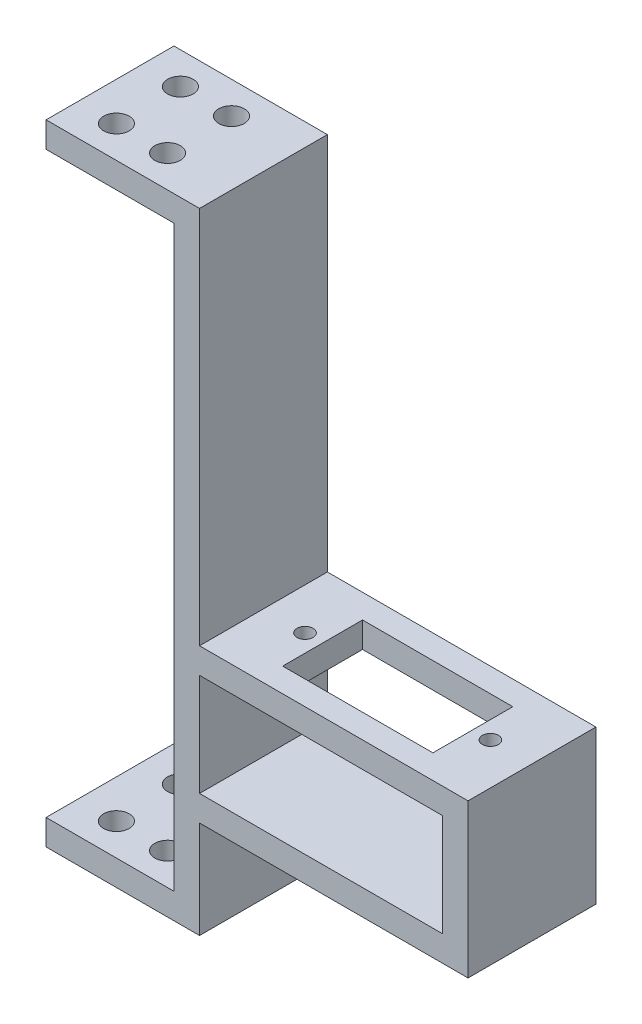
ISO-10303-21;
HEADER;
FILE_DESCRIPTION(('STEP AP214'),'2;1');
FILE_NAME('part.step','',(''),(''),'','','');
FILE_SCHEMA(('AUTOMOTIVE_DESIGN { 1 0 10303 214 1 1 1 1 }'));
ENDSEC;
DATA;
#1=APPLICATION_CONTEXT('core data for automotive mechanical design processes');
#2=APPLICATION_PROTOCOL_DEFINITION('international standard','automotive_design',2000,#1);
#3=PRODUCT_CONTEXT('',#1,'mechanical');
#4=PRODUCT('Part','Part','',(#3));
#5=PRODUCT_RELATED_PRODUCT_CATEGORY('part','',(#4));
#6=PRODUCT_DEFINITION_FORMATION('','',#4);
#7=PRODUCT_DEFINITION_CONTEXT('part definition',#1,'design');
#8=PRODUCT_DEFINITION('design','',#6,#7);
#9=PRODUCT_DEFINITION_SHAPE('','',#8);
#10=(LENGTH_UNIT() NAMED_UNIT(*) SI_UNIT(.MILLI.,.METRE.));
#11=(NAMED_UNIT(*) PLANE_ANGLE_UNIT() SI_UNIT($,.RADIAN.));
#12=(NAMED_UNIT(*) SI_UNIT($,.STERADIAN.) SOLID_ANGLE_UNIT());
#13=UNCERTAINTY_MEASURE_WITH_UNIT(LENGTH_MEASURE(1.E-05),#10,'distance_accuracy_value','');
#14=(GEOMETRIC_REPRESENTATION_CONTEXT(3) GLOBAL_UNCERTAINTY_ASSIGNED_CONTEXT((#13)) GLOBAL_UNIT_ASSIGNED_CONTEXT((#10,
#11,#12)) REPRESENTATION_CONTEXT('',''));
#15=CARTESIAN_POINT('',(0.,0.,0.));
#16=DIRECTION('',(0.,0.,1.));
#17=DIRECTION('',(1.,0.,0.));
#18=AXIS2_PLACEMENT_3D('',#15,#16,#17);
#19=CARTESIAN_POINT('',(0.,49.25,10.));
#20=DIRECTION('',(-1.,0.,0.));
#21=DIRECTION('',(0.,0.,1.));
#22=AXIS2_PLACEMENT_3D('',#19,#20,#21);
#23=PLANE('',#22);
#24=DIRECTION('',(0.,1.,0.));
#25=VECTOR('',#24,1.);
#26=CARTESIAN_POINT('',(0.,49.25,-10.));
#27=LINE('',#26,#25);
#28=CARTESIAN_POINT('',(0.,-49.25,-10.));
#29=VERTEX_POINT('',#28);
#30=CARTESIAN_POINT('',(0.,-34.,-10.));
#31=VERTEX_POINT('',#30);
#32=EDGE_CURVE('E289',#29,#31,#27,.T.);
#33=ORIENTED_EDGE('',*,*,#32,.T.);
#34=DIRECTION('',(0.,0.,1.));
#35=VECTOR('',#34,1.);
#36=CARTESIAN_POINT('',(0.,-34.,-10.));
#37=LINE('',#36,#35);
#38=CARTESIAN_POINT('',(0.,-34.,10.));
#39=VERTEX_POINT('',#38);
#40=EDGE_CURVE('E244',#31,#39,#37,.T.);
#41=ORIENTED_EDGE('',*,*,#40,.T.);
#42=DIRECTION('',(0.,1.,0.));
#43=VECTOR('',#42,1.);
#44=CARTESIAN_POINT('',(0.,49.25,10.));
#45=LINE('',#44,#43);
#46=CARTESIAN_POINT('',(0.,-49.25,10.));
#47=VERTEX_POINT('',#46);
#48=EDGE_CURVE('E269',#47,#39,#45,.T.);
#49=ORIENTED_EDGE('',*,*,#48,.F.);
#50=DIRECTION('',(0.,0.,-1.));
#51=VECTOR('',#50,1.);
#52=CARTESIAN_POINT('',(0.,-49.25,10.));
#53=LINE('',#52,#51);
#54=EDGE_CURVE('E298',#47,#29,#53,.T.);
#55=ORIENTED_EDGE('',*,*,#54,.T.);
#56=EDGE_LOOP('',(#33,#41,#49,#55));
#57=FACE_BOUND('',#56,.T.);
#58=ADVANCED_FACE('F33',(#57),#23,.F.);
#59=CARTESIAN_POINT('',(0.,-9.99999999999999,10.));
#60=VERTEX_POINT('',#59);
#61=CARTESIAN_POINT('',(0.,49.25,10.));
#62=VERTEX_POINT('',#61);
#63=EDGE_CURVE('E268',#60,#62,#45,.T.);
#64=ORIENTED_EDGE('',*,*,#63,.F.);
#65=DIRECTION('',(0.,0.,1.));
#66=VECTOR('',#65,1.);
#67=CARTESIAN_POINT('',(0.,-10.,-10.));
#68=LINE('',#67,#66);
#69=CARTESIAN_POINT('',(0.,-10.,-10.));
#70=VERTEX_POINT('',#69);
#71=EDGE_CURVE('E236',#70,#60,#68,.T.);
#72=ORIENTED_EDGE('',*,*,#71,.F.);
#73=CARTESIAN_POINT('',(0.,49.25,-10.));
#74=VERTEX_POINT('',#73);
#75=EDGE_CURVE('E288',#70,#74,#27,.T.);
#76=ORIENTED_EDGE('',*,*,#75,.T.);
#77=DIRECTION('',(0.,0.,-1.));
#78=VECTOR('',#77,1.);
#79=CARTESIAN_POINT('',(0.,49.25,10.));
#80=LINE('',#79,#78);
#81=EDGE_CURVE('E295',#62,#74,#80,.T.);
#82=ORIENTED_EDGE('',*,*,#81,.F.);
#83=EDGE_LOOP('',(#64,#72,#76,#82));
#84=FACE_BOUND('',#83,.T.);
#85=ADVANCED_FACE('F414',(#84),#23,.F.);
#86=CARTESIAN_POINT('',(-24.,49.25,10.));
#87=DIRECTION('',(1.,0.,0.));
#88=DIRECTION('',(0.,0.,-1.));
#89=AXIS2_PLACEMENT_3D('',#86,#87,#88);
#90=PLANE('',#89);
#91=DIRECTION('',(0.,-1.,0.));
#92=VECTOR('',#91,1.);
#93=CARTESIAN_POINT('',(-24.,49.25,-10.));
#94=LINE('',#93,#92);
#95=CARTESIAN_POINT('',(-24.,49.25,-10.));
#96=VERTEX_POINT('',#95);
#97=CARTESIAN_POINT('',(-24.,45.25,-10.));
#98=VERTEX_POINT('',#97);
#99=EDGE_CURVE('E239',#96,#98,#94,.T.);
#100=ORIENTED_EDGE('',*,*,#99,.T.);
#101=DIRECTION('',(0.,0.,-1.));
#102=VECTOR('',#101,1.);
#103=CARTESIAN_POINT('',(-24.,45.25,10.));
#104=LINE('',#103,#102);
#105=CARTESIAN_POINT('',(-24.,45.25,10.));
#106=VERTEX_POINT('',#105);
#107=EDGE_CURVE('E313',#106,#98,#104,.T.);
#108=ORIENTED_EDGE('',*,*,#107,.F.);
#109=DIRECTION('',(0.,-1.,0.));
#110=VECTOR('',#109,1.);
#111=CARTESIAN_POINT('',(-24.,49.25,10.));
#112=LINE('',#111,#110);
#113=CARTESIAN_POINT('',(-24.,49.25,10.));
#114=VERTEX_POINT('',#113);
#115=EDGE_CURVE('E254',#114,#106,#112,.T.);
#116=ORIENTED_EDGE('',*,*,#115,.F.);
#117=DIRECTION('',(0.,0.,-1.));
#118=VECTOR('',#117,1.);
#119=CARTESIAN_POINT('',(-24.,49.25,10.));
#120=LINE('',#119,#118);
#121=EDGE_CURVE('E275',#114,#96,#120,.T.);
#122=ORIENTED_EDGE('',*,*,#121,.T.);
#123=EDGE_LOOP('',(#100,#108,#116,#122));
#124=FACE_BOUND('',#123,.T.);
#125=ADVANCED_FACE('F35',(#124),#90,.F.);
#126=CARTESIAN_POINT('',(-24.,45.25,10.));
#127=DIRECTION('',(0.,1.,0.));
#128=DIRECTION('',(0.,0.,1.));
#129=AXIS2_PLACEMENT_3D('',#126,#127,#128);
#130=PLANE('',#129);
#131=CARTESIAN_POINT('',(-18.,45.25,-5.));
#132=DIRECTION('',(0.,1.,0.));
#133=DIRECTION('',(0.,0.,1.));
#134=AXIS2_PLACEMENT_3D('',#131,#132,#133);
#135=CIRCLE('',#134,2.);
#136=CARTESIAN_POINT('',(-18.,45.25,-3.));
#137=VERTEX_POINT('',#136);
#138=EDGE_CURVE('E331',#137,#137,#135,.T.);
#139=ORIENTED_EDGE('',*,*,#138,.T.);
#140=EDGE_LOOP('',(#139));
#141=FACE_BOUND('',#140,.T.);
#142=CARTESIAN_POINT('',(-9.99999999999996,45.25,-5.));
#143=DIRECTION('',(0.,1.,0.));
#144=DIRECTION('',(0.,0.,1.));
#145=AXIS2_PLACEMENT_3D('',#142,#143,#144);
#146=CIRCLE('',#145,2.);
#147=CARTESIAN_POINT('',(-9.99999999999996,45.25,-3.));
#148=VERTEX_POINT('',#147);
#149=EDGE_CURVE('E339',#148,#148,#146,.T.);
#150=ORIENTED_EDGE('',*,*,#149,.T.);
#151=EDGE_LOOP('',(#150));
#152=FACE_BOUND('',#151,.T.);
#153=CARTESIAN_POINT('',(-9.99999999999997,45.25,5.));
#154=DIRECTION('',(0.,1.,0.));
#155=DIRECTION('',(0.,0.,1.));
#156=AXIS2_PLACEMENT_3D('',#153,#154,#155);
#157=CIRCLE('',#156,2.);
#158=CARTESIAN_POINT('',(-9.99999999999997,45.25,7.));
#159=VERTEX_POINT('',#158);
#160=EDGE_CURVE('E345',#159,#159,#157,.T.);
#161=ORIENTED_EDGE('',*,*,#160,.T.);
#162=EDGE_LOOP('',(#161));
#163=FACE_BOUND('',#162,.T.);
#164=CARTESIAN_POINT('',(-18.,45.25,5.));
#165=DIRECTION('',(0.,1.,0.));
#166=DIRECTION('',(0.,0.,1.));
#167=AXIS2_PLACEMENT_3D('',#164,#165,#166);
#168=CIRCLE('',#167,2.);
#169=CARTESIAN_POINT('',(-18.,45.25,7.));
#170=VERTEX_POINT('',#169);
#171=EDGE_CURVE('E351',#170,#170,#168,.T.);
#172=ORIENTED_EDGE('',*,*,#171,.T.);
#173=EDGE_LOOP('',(#172));
#174=FACE_BOUND('',#173,.T.);
#175=DIRECTION('',(1.,0.,0.));
#176=VECTOR('',#175,1.);
#177=CARTESIAN_POINT('',(-24.,45.25,-10.));
#178=LINE('',#177,#176);
#179=CARTESIAN_POINT('',(-4.,45.25,-10.));
#180=VERTEX_POINT('',#179);
#181=EDGE_CURVE('E278',#98,#180,#178,.T.);
#182=ORIENTED_EDGE('',*,*,#181,.T.);
#183=DIRECTION('',(0.,0.,-1.));
#184=VECTOR('',#183,1.);
#185=CARTESIAN_POINT('',(-4.,45.25,10.));
#186=LINE('',#185,#184);
#187=CARTESIAN_POINT('',(-4.,45.25,10.));
#188=VERTEX_POINT('',#187);
#189=EDGE_CURVE('E310',#188,#180,#186,.T.);
#190=ORIENTED_EDGE('',*,*,#189,.F.);
#191=DIRECTION('',(1.,0.,0.));
#192=VECTOR('',#191,1.);
#193=CARTESIAN_POINT('',(-24.,45.25,10.));
#194=LINE('',#193,#192);
#195=EDGE_CURVE('E257',#106,#188,#194,.T.);
#196=ORIENTED_EDGE('',*,*,#195,.F.);
#197=ORIENTED_EDGE('',*,*,#107,.T.);
#198=EDGE_LOOP('',(#182,#190,#196,#197));
#199=FACE_BOUND('',#198,.T.);
#200=ADVANCED_FACE('F408',(#141,#152,#163,#174,#199),#130,.F.);
#201=CARTESIAN_POINT('',(-4.,45.25,10.));
#202=DIRECTION('',(1.,0.,0.));
#203=DIRECTION('',(0.,1.,0.));
#204=AXIS2_PLACEMENT_3D('',#201,#202,#203);
#205=PLANE('',#204);
#206=DIRECTION('',(0.,-1.,0.));
#207=VECTOR('',#206,1.);
#208=CARTESIAN_POINT('',(-4.,45.25,-10.));
#209=LINE('',#208,#207);
#210=CARTESIAN_POINT('',(-3.99999999999999,-45.25,-10.));
#211=VERTEX_POINT('',#210);
#212=EDGE_CURVE('E280',#180,#211,#209,.T.);
#213=ORIENTED_EDGE('',*,*,#212,.T.);
#214=DIRECTION('',(0.,0.,-1.));
#215=VECTOR('',#214,1.);
#216=CARTESIAN_POINT('',(-3.99999999999999,-45.25,10.));
#217=LINE('',#216,#215);
#218=CARTESIAN_POINT('',(-3.99999999999999,-45.25,10.));
#219=VERTEX_POINT('',#218);
#220=EDGE_CURVE('E307',#219,#211,#217,.T.);
#221=ORIENTED_EDGE('',*,*,#220,.F.);
#222=DIRECTION('',(0.,-1.,0.));
#223=VECTOR('',#222,1.);
#224=CARTESIAN_POINT('',(-4.,45.25,10.));
#225=LINE('',#224,#223);
#226=EDGE_CURVE('E260',#188,#219,#225,.T.);
#227=ORIENTED_EDGE('',*,*,#226,.F.);
#228=ORIENTED_EDGE('',*,*,#189,.T.);
#229=EDGE_LOOP('',(#213,#221,#227,#228));
#230=FACE_BOUND('',#229,.T.);
#231=ADVANCED_FACE('F469',(#230),#205,.F.);
#232=CARTESIAN_POINT('',(-3.99999999999999,-45.25,10.));
#233=DIRECTION('',(0.,-1.,0.));
#234=DIRECTION('',(0.,0.,-1.));
#235=AXIS2_PLACEMENT_3D('',#232,#233,#234);
#236=PLANE('',#235);
#237=CARTESIAN_POINT('',(-17.9999999999999,-45.25,-5.));
#238=DIRECTION('',(0.,-1.,0.));
#239=DIRECTION('',(0.,0.,-1.));
#240=AXIS2_PLACEMENT_3D('',#237,#238,#239);
#241=CIRCLE('',#240,2.);
#242=CARTESIAN_POINT('',(-17.9999999999999,-45.25,-7.));
#243=VERTEX_POINT('',#242);
#244=EDGE_CURVE('E336',#243,#243,#241,.T.);
#245=ORIENTED_EDGE('',*,*,#244,.T.);
#246=EDGE_LOOP('',(#245));
#247=FACE_BOUND('',#246,.T.);
#248=CARTESIAN_POINT('',(-9.99999999999993,-45.25,-5.));
#249=DIRECTION('',(0.,-1.,0.));
#250=DIRECTION('',(0.,0.,-1.));
#251=AXIS2_PLACEMENT_3D('',#248,#249,#250);
#252=CIRCLE('',#251,2.);
#253=CARTESIAN_POINT('',(-9.99999999999993,-45.25,-7.));
#254=VERTEX_POINT('',#253);
#255=EDGE_CURVE('E342',#254,#254,#252,.T.);
#256=ORIENTED_EDGE('',*,*,#255,.T.);
#257=EDGE_LOOP('',(#256));
#258=FACE_BOUND('',#257,.T.);
#259=CARTESIAN_POINT('',(-9.99999999999993,-45.25,5.));
#260=DIRECTION('',(0.,-1.,0.));
#261=DIRECTION('',(0.,0.,-1.));
#262=AXIS2_PLACEMENT_3D('',#259,#260,#261);
#263=CIRCLE('',#262,2.);
#264=CARTESIAN_POINT('',(-9.99999999999993,-45.25,3.));
#265=VERTEX_POINT('',#264);
#266=EDGE_CURVE('E348',#265,#265,#263,.T.);
#267=ORIENTED_EDGE('',*,*,#266,.T.);
#268=EDGE_LOOP('',(#267));
#269=FACE_BOUND('',#268,.T.);
#270=CARTESIAN_POINT('',(-17.9999999999999,-45.25,5.));
#271=DIRECTION('',(0.,-1.,0.));
#272=DIRECTION('',(0.,0.,-1.));
#273=AXIS2_PLACEMENT_3D('',#270,#271,#272);
#274=CIRCLE('',#273,2.);
#275=CARTESIAN_POINT('',(-17.9999999999999,-45.25,3.));
#276=VERTEX_POINT('',#275);
#277=EDGE_CURVE('E354',#276,#276,#274,.T.);
#278=ORIENTED_EDGE('',*,*,#277,.T.);
#279=EDGE_LOOP('',(#278));
#280=FACE_BOUND('',#279,.T.);
#281=DIRECTION('',(-1.,0.,0.));
#282=VECTOR('',#281,1.);
#283=CARTESIAN_POINT('',(-3.99999999999999,-45.25,-10.));
#284=LINE('',#283,#282);
#285=CARTESIAN_POINT('',(-24.,-45.25,-10.));
#286=VERTEX_POINT('',#285);
#287=EDGE_CURVE('E282',#211,#286,#284,.T.);
#288=ORIENTED_EDGE('',*,*,#287,.T.);
#289=DIRECTION('',(0.,0.,-1.));
#290=VECTOR('',#289,1.);
#291=CARTESIAN_POINT('',(-24.,-45.25,10.));
#292=LINE('',#291,#290);
#293=CARTESIAN_POINT('',(-24.,-45.25,10.));
#294=VERTEX_POINT('',#293);
#295=EDGE_CURVE('E304',#294,#286,#292,.T.);
#296=ORIENTED_EDGE('',*,*,#295,.F.);
#297=DIRECTION('',(-1.,0.,0.));
#298=VECTOR('',#297,1.);
#299=CARTESIAN_POINT('',(-3.99999999999999,-45.25,10.));
#300=LINE('',#299,#298);
#301=EDGE_CURVE('E262',#219,#294,#300,.T.);
#302=ORIENTED_EDGE('',*,*,#301,.F.);
#303=ORIENTED_EDGE('',*,*,#220,.T.);
#304=EDGE_LOOP('',(#288,#296,#302,#303));
#305=FACE_BOUND('',#304,.T.);
#306=ADVANCED_FACE('F462',(#247,#258,#269,#280,#305),#236,.F.);
#307=CARTESIAN_POINT('',(-24.,-49.25,10.));
#308=DIRECTION('',(1.,0.,0.));
#309=DIRECTION('',(0.,0.,-1.));
#310=AXIS2_PLACEMENT_3D('',#307,#308,#309);
#311=PLANE('',#310);
#312=DIRECTION('',(0.,-1.,0.));
#313=VECTOR('',#312,1.);
#314=CARTESIAN_POINT('',(-24.,-49.25,-10.));
#315=LINE('',#314,#313);
#316=CARTESIAN_POINT('',(-24.,-49.25,-10.));
#317=VERTEX_POINT('',#316);
#318=EDGE_CURVE('E284',#286,#317,#315,.T.);
#319=ORIENTED_EDGE('',*,*,#318,.T.);
#320=DIRECTION('',(0.,0.,-1.));
#321=VECTOR('',#320,1.);
#322=CARTESIAN_POINT('',(-24.,-49.25,10.));
#323=LINE('',#322,#321);
#324=CARTESIAN_POINT('',(-24.,-49.25,10.));
#325=VERTEX_POINT('',#324);
#326=EDGE_CURVE('E301',#325,#317,#323,.T.);
#327=ORIENTED_EDGE('',*,*,#326,.F.);
#328=DIRECTION('',(0.,-1.,0.));
#329=VECTOR('',#328,1.);
#330=CARTESIAN_POINT('',(-24.,-49.25,10.));
#331=LINE('',#330,#329);
#332=EDGE_CURVE('E264',#294,#325,#331,.T.);
#333=ORIENTED_EDGE('',*,*,#332,.F.);
#334=ORIENTED_EDGE('',*,*,#295,.T.);
#335=EDGE_LOOP('',(#319,#327,#333,#334));
#336=FACE_BOUND('',#335,.T.);
#337=ADVANCED_FACE('F457',(#336),#311,.F.);
#338=CARTESIAN_POINT('',(0.,-49.25,10.));
#339=DIRECTION('',(0.,1.,0.));
#340=DIRECTION('',(-1.,0.,0.));
#341=AXIS2_PLACEMENT_3D('',#338,#339,#340);
#342=PLANE('',#341);
#343=CARTESIAN_POINT('',(-17.9999999999999,-49.25,-5.));
#344=DIRECTION('',(0.,1.,0.));
#345=DIRECTION('',(-1.,0.,0.));
#346=AXIS2_PLACEMENT_3D('',#343,#344,#345);
#347=CIRCLE('',#346,2.);
#348=CARTESIAN_POINT('',(-19.9999999999999,-49.25,-5.));
#349=VERTEX_POINT('',#348);
#350=EDGE_CURVE('E364',#349,#349,#347,.T.);
#351=ORIENTED_EDGE('',*,*,#350,.T.);
#352=EDGE_LOOP('',(#351));
#353=FACE_BOUND('',#352,.T.);
#354=CARTESIAN_POINT('',(-9.99999999999993,-49.25,-5.));
#355=DIRECTION('',(0.,1.,0.));
#356=DIRECTION('',(-1.,0.,0.));
#357=AXIS2_PLACEMENT_3D('',#354,#355,#356);
#358=CIRCLE('',#357,2.);
#359=CARTESIAN_POINT('',(-11.9999999999999,-49.25,-5.));
#360=VERTEX_POINT('',#359);
#361=EDGE_CURVE('E370',#360,#360,#358,.T.);
#362=ORIENTED_EDGE('',*,*,#361,.T.);
#363=EDGE_LOOP('',(#362));
#364=FACE_BOUND('',#363,.T.);
#365=CARTESIAN_POINT('',(-9.99999999999993,-49.25,5.));
#366=DIRECTION('',(0.,1.,0.));
#367=DIRECTION('',(-1.,0.,0.));
#368=AXIS2_PLACEMENT_3D('',#365,#366,#367);
#369=CIRCLE('',#368,2.);
#370=CARTESIAN_POINT('',(-11.9999999999999,-49.25,5.));
#371=VERTEX_POINT('',#370);
#372=EDGE_CURVE('E376',#371,#371,#369,.T.);
#373=ORIENTED_EDGE('',*,*,#372,.T.);
#374=EDGE_LOOP('',(#373));
#375=FACE_BOUND('',#374,.T.);
#376=CARTESIAN_POINT('',(-17.9999999999999,-49.25,5.));
#377=DIRECTION('',(0.,1.,0.));
#378=DIRECTION('',(-1.,0.,0.));
#379=AXIS2_PLACEMENT_3D('',#376,#377,#378);
#380=CIRCLE('',#379,2.);
#381=CARTESIAN_POINT('',(-19.9999999999999,-49.25,5.));
#382=VERTEX_POINT('',#381);
#383=EDGE_CURVE('E357',#382,#382,#380,.T.);
#384=ORIENTED_EDGE('',*,*,#383,.T.);
#385=EDGE_LOOP('',(#384));
#386=FACE_BOUND('',#385,.T.);
#387=DIRECTION('',(1.,0.,0.));
#388=VECTOR('',#387,1.);
#389=CARTESIAN_POINT('',(0.,-49.25,-10.));
#390=LINE('',#389,#388);
#391=EDGE_CURVE('E286',#317,#29,#390,.T.);
#392=ORIENTED_EDGE('',*,*,#391,.T.);
#393=ORIENTED_EDGE('',*,*,#54,.F.);
#394=DIRECTION('',(1.,0.,0.));
#395=VECTOR('',#394,1.);
#396=CARTESIAN_POINT('',(0.,-49.25,10.));
#397=LINE('',#396,#395);
#398=EDGE_CURVE('E266',#325,#47,#397,.T.);
#399=ORIENTED_EDGE('',*,*,#398,.F.);
#400=ORIENTED_EDGE('',*,*,#326,.T.);
#401=EDGE_LOOP('',(#392,#393,#399,#400));
#402=FACE_BOUND('',#401,.T.);
#403=ADVANCED_FACE('F453',(#353,#364,#375,#386,#402),#342,.F.);
#404=CARTESIAN_POINT('',(0.,-30.,10.));
#405=VERTEX_POINT('',#404);
#406=CARTESIAN_POINT('',(0.,-14.,10.));
#407=VERTEX_POINT('',#406);
#408=EDGE_CURVE('E273',#405,#407,#45,.T.);
#409=ORIENTED_EDGE('',*,*,#408,.F.);
#410=DIRECTION('',(0.,0.,1.));
#411=VECTOR('',#410,1.);
#412=CARTESIAN_POINT('',(0.,-30.,-10.));
#413=LINE('',#412,#411);
#414=CARTESIAN_POINT('',(0.,-30.,-10.));
#415=VERTEX_POINT('',#414);
#416=EDGE_CURVE('E246',#415,#405,#413,.T.);
#417=ORIENTED_EDGE('',*,*,#416,.F.);
#418=CARTESIAN_POINT('',(0.,-14.,-10.));
#419=VERTEX_POINT('',#418);
#420=EDGE_CURVE('E291',#415,#419,#27,.T.);
#421=ORIENTED_EDGE('',*,*,#420,.T.);
#422=DIRECTION('',(0.,0.,1.));
#423=VECTOR('',#422,1.);
#424=CARTESIAN_POINT('',(0.,-14.,-10.));
#425=LINE('',#424,#423);
#426=EDGE_CURVE('E219',#419,#407,#425,.T.);
#427=ORIENTED_EDGE('',*,*,#426,.T.);
#428=EDGE_LOOP('',(#409,#417,#421,#427));
#429=FACE_BOUND('',#428,.T.);
#430=ADVANCED_FACE('F389',(#429),#23,.F.);
#431=CARTESIAN_POINT('',(-24.,49.25,10.));
#432=DIRECTION('',(0.,-1.,0.));
#433=DIRECTION('',(1.,0.,0.));
#434=AXIS2_PLACEMENT_3D('',#431,#432,#433);
#435=PLANE('',#434);
#436=CARTESIAN_POINT('',(-18.,49.25,-5.));
#437=DIRECTION('',(0.,1.,0.));
#438=DIRECTION('',(-1.,0.,0.));
#439=AXIS2_PLACEMENT_3D('',#436,#437,#438);
#440=CIRCLE('',#439,2.);
#441=CARTESIAN_POINT('',(-20.,49.25,-5.));
#442=VERTEX_POINT('',#441);
#443=EDGE_CURVE('E367',#442,#442,#440,.T.);
#444=ORIENTED_EDGE('',*,*,#443,.F.);
#445=EDGE_LOOP('',(#444));
#446=FACE_BOUND('',#445,.T.);
#447=CARTESIAN_POINT('',(-9.99999999999996,49.25,-5.));
#448=DIRECTION('',(0.,1.,0.));
#449=DIRECTION('',(-1.,0.,0.));
#450=AXIS2_PLACEMENT_3D('',#447,#448,#449);
#451=CIRCLE('',#450,2.);
#452=CARTESIAN_POINT('',(-12.,49.25,-5.));
#453=VERTEX_POINT('',#452);
#454=EDGE_CURVE('E373',#453,#453,#451,.T.);
#455=ORIENTED_EDGE('',*,*,#454,.F.);
#456=EDGE_LOOP('',(#455));
#457=FACE_BOUND('',#456,.T.);
#458=CARTESIAN_POINT('',(-9.99999999999997,49.25,5.));
#459=DIRECTION('',(0.,1.,0.));
#460=DIRECTION('',(-1.,0.,0.));
#461=AXIS2_PLACEMENT_3D('',#458,#459,#460);
#462=CIRCLE('',#461,2.);
#463=CARTESIAN_POINT('',(-12.,49.25,5.));
#464=VERTEX_POINT('',#463);
#465=EDGE_CURVE('E361',#464,#464,#462,.T.);
#466=ORIENTED_EDGE('',*,*,#465,.F.);
#467=EDGE_LOOP('',(#466));
#468=FACE_BOUND('',#467,.T.);
#469=CARTESIAN_POINT('',(-18.,49.25,5.));
#470=DIRECTION('',(0.,1.,0.));
#471=DIRECTION('',(-1.,0.,0.));
#472=AXIS2_PLACEMENT_3D('',#469,#470,#471);
#473=CIRCLE('',#472,2.);
#474=CARTESIAN_POINT('',(-20.,49.25,5.));
#475=VERTEX_POINT('',#474);
#476=EDGE_CURVE('E358',#475,#475,#473,.T.);
#477=ORIENTED_EDGE('',*,*,#476,.F.);
#478=EDGE_LOOP('',(#477));
#479=FACE_BOUND('',#478,.T.);
#480=DIRECTION('',(-1.,0.,0.));
#481=VECTOR('',#480,1.);
#482=CARTESIAN_POINT('',(-24.,49.25,-10.));
#483=LINE('',#482,#481);
#484=EDGE_CURVE('E258',#74,#96,#483,.T.);
#485=ORIENTED_EDGE('',*,*,#484,.T.);
#486=ORIENTED_EDGE('',*,*,#121,.F.);
#487=DIRECTION('',(-1.,0.,0.));
#488=VECTOR('',#487,1.);
#489=CARTESIAN_POINT('',(-24.,49.25,10.));
#490=LINE('',#489,#488);
#491=EDGE_CURVE('E272',#62,#114,#490,.T.);
#492=ORIENTED_EDGE('',*,*,#491,.F.);
#493=ORIENTED_EDGE('',*,*,#81,.T.);
#494=EDGE_LOOP('',(#485,#486,#492,#493));
#495=FACE_BOUND('',#494,.T.);
#496=ADVANCED_FACE('F385',(#446,#457,#468,#479,#495),#435,.F.);
#497=CARTESIAN_POINT('',(0.,0.,10.));
#498=DIRECTION('',(0.,0.,1.));
#499=DIRECTION('',(1.,0.,0.));
#500=AXIS2_PLACEMENT_3D('',#497,#498,#499);
#501=PLANE('',#500);
#502=ORIENTED_EDGE('',*,*,#408,.T.);
#503=DIRECTION('',(1.,0.,0.));
#504=VECTOR('',#503,1.);
#505=CARTESIAN_POINT('',(0.,-14.,10.));
#506=LINE('',#505,#504);
#507=CARTESIAN_POINT('',(38.,-14.,10.));
#508=VERTEX_POINT('',#507);
#509=EDGE_CURVE('E197',#407,#508,#506,.T.);
#510=ORIENTED_EDGE('',*,*,#509,.T.);
#511=DIRECTION('',(0.,-1.,0.));
#512=VECTOR('',#511,1.);
#513=CARTESIAN_POINT('',(38.,-14.,10.));
#514=LINE('',#513,#512);
#515=CARTESIAN_POINT('',(38.,-30.,10.));
#516=VERTEX_POINT('',#515);
#517=EDGE_CURVE('E222',#508,#516,#514,.T.);
#518=ORIENTED_EDGE('',*,*,#517,.T.);
#519=DIRECTION('',(-1.,0.,0.));
#520=VECTOR('',#519,1.);
#521=CARTESIAN_POINT('',(38.,-30.,10.));
#522=LINE('',#521,#520);
#523=EDGE_CURVE('E225',#516,#405,#522,.T.);
#524=ORIENTED_EDGE('',*,*,#523,.T.);
#525=EDGE_LOOP('',(#502,#510,#518,#524));
#526=FACE_BOUND('',#525,.T.);
#527=ORIENTED_EDGE('',*,*,#115,.T.);
#528=ORIENTED_EDGE('',*,*,#195,.T.);
#529=ORIENTED_EDGE('',*,*,#226,.T.);
#530=ORIENTED_EDGE('',*,*,#301,.T.);
#531=ORIENTED_EDGE('',*,*,#332,.T.);
#532=ORIENTED_EDGE('',*,*,#398,.T.);
#533=ORIENTED_EDGE('',*,*,#48,.T.);
#534=DIRECTION('',(1.,0.,0.));
#535=VECTOR('',#534,1.);
#536=CARTESIAN_POINT('',(42.,-34.,10.));
#537=LINE('',#536,#535);
#538=CARTESIAN_POINT('',(42.,-34.,10.));
#539=VERTEX_POINT('',#538);
#540=EDGE_CURVE('E228',#39,#539,#537,.T.);
#541=ORIENTED_EDGE('',*,*,#540,.T.);
#542=DIRECTION('',(0.,1.,0.));
#543=VECTOR('',#542,1.);
#544=CARTESIAN_POINT('',(42.,-10.,10.));
#545=LINE('',#544,#543);
#546=CARTESIAN_POINT('',(42.,-10.,10.));
#547=VERTEX_POINT('',#546);
#548=EDGE_CURVE('E231',#539,#547,#545,.T.);
#549=ORIENTED_EDGE('',*,*,#548,.T.);
#550=DIRECTION('',(-1.,0.,0.));
#551=VECTOR('',#550,1.);
#552=CARTESIAN_POINT('',(0.,-10.,10.));
#553=LINE('',#552,#551);
#554=EDGE_CURVE('E204',#547,#60,#553,.T.);
#555=ORIENTED_EDGE('',*,*,#554,.T.);
#556=ORIENTED_EDGE('',*,*,#63,.T.);
#557=ORIENTED_EDGE('',*,*,#491,.T.);
#558=EDGE_LOOP('',(#527,#528,#529,#530,#531,#532,#533,#541,#549,#555,#556,#557));
#559=FACE_BOUND('',#558,.T.);
#560=ADVANCED_FACE('F388',(#526,#559),#501,.T.);
#561=CARTESIAN_POINT('',(0.,0.,-10.));
#562=DIRECTION('',(0.,0.,1.));
#563=DIRECTION('',(1.,0.,0.));
#564=AXIS2_PLACEMENT_3D('',#561,#562,#563);
#565=PLANE('',#564);
#566=DIRECTION('',(1.,0.,0.));
#567=VECTOR('',#566,1.);
#568=CARTESIAN_POINT('',(0.,-14.,-10.));
#569=LINE('',#568,#567);
#570=CARTESIAN_POINT('',(38.,-14.,-10.));
#571=VERTEX_POINT('',#570);
#572=EDGE_CURVE('E200',#419,#571,#569,.T.);
#573=ORIENTED_EDGE('',*,*,#572,.F.);
#574=ORIENTED_EDGE('',*,*,#420,.F.);
#575=DIRECTION('',(-1.,0.,0.));
#576=VECTOR('',#575,1.);
#577=CARTESIAN_POINT('',(38.,-30.,-10.));
#578=LINE('',#577,#576);
#579=CARTESIAN_POINT('',(38.,-30.,-10.));
#580=VERTEX_POINT('',#579);
#581=EDGE_CURVE('E207',#580,#415,#578,.T.);
#582=ORIENTED_EDGE('',*,*,#581,.F.);
#583=DIRECTION('',(0.,-1.,0.));
#584=VECTOR('',#583,1.);
#585=CARTESIAN_POINT('',(38.,-14.,-10.));
#586=LINE('',#585,#584);
#587=EDGE_CURVE('E203',#571,#580,#586,.T.);
#588=ORIENTED_EDGE('',*,*,#587,.F.);
#589=EDGE_LOOP('',(#573,#574,#582,#588));
#590=FACE_BOUND('',#589,.T.);
#591=ORIENTED_EDGE('',*,*,#99,.F.);
#592=ORIENTED_EDGE('',*,*,#484,.F.);
#593=ORIENTED_EDGE('',*,*,#75,.F.);
#594=DIRECTION('',(-1.,0.,0.));
#595=VECTOR('',#594,1.);
#596=CARTESIAN_POINT('',(0.,-10.,-10.));
#597=LINE('',#596,#595);
#598=CARTESIAN_POINT('',(42.,-10.,-10.));
#599=VERTEX_POINT('',#598);
#600=EDGE_CURVE('E216',#599,#70,#597,.T.);
#601=ORIENTED_EDGE('',*,*,#600,.F.);
#602=DIRECTION('',(0.,1.,0.));
#603=VECTOR('',#602,1.);
#604=CARTESIAN_POINT('',(42.,-10.,-10.));
#605=LINE('',#604,#603);
#606=CARTESIAN_POINT('',(42.,-34.,-10.));
#607=VERTEX_POINT('',#606);
#608=EDGE_CURVE('E213',#607,#599,#605,.T.);
#609=ORIENTED_EDGE('',*,*,#608,.F.);
#610=DIRECTION('',(1.,0.,0.));
#611=VECTOR('',#610,1.);
#612=CARTESIAN_POINT('',(42.,-34.,-10.));
#613=LINE('',#612,#611);
#614=EDGE_CURVE('E210',#31,#607,#613,.T.);
#615=ORIENTED_EDGE('',*,*,#614,.F.);
#616=ORIENTED_EDGE('',*,*,#32,.F.);
#617=ORIENTED_EDGE('',*,*,#391,.F.);
#618=ORIENTED_EDGE('',*,*,#318,.F.);
#619=ORIENTED_EDGE('',*,*,#287,.F.);
#620=ORIENTED_EDGE('',*,*,#212,.F.);
#621=ORIENTED_EDGE('',*,*,#181,.F.);
#622=EDGE_LOOP('',(#591,#592,#593,#601,#609,#615,#616,#617,#618,#619,#620,#621));
#623=FACE_BOUND('',#622,.T.);
#624=ADVANCED_FACE('F403',(#590,#623),#565,.F.);
#625=CARTESIAN_POINT('',(0.,-10.,-10.));
#626=DIRECTION('',(0.,1.,0.));
#627=DIRECTION('',(0.,0.,1.));
#628=AXIS2_PLACEMENT_3D('',#625,#626,#627);
#629=PLANE('',#628);
#630=CARTESIAN_POINT('',(35.5,-10.,0.));
#631=DIRECTION('',(0.,1.,0.));
#632=DIRECTION('',(0.,0.,1.));
#633=AXIS2_PLACEMENT_3D('',#630,#631,#632);
#634=CIRCLE('',#633,1.25);
#635=CARTESIAN_POINT('',(35.5,-10.,1.25));
#636=VERTEX_POINT('',#635);
#637=EDGE_CURVE('E321',#636,#636,#634,.T.);
#638=ORIENTED_EDGE('',*,*,#637,.F.);
#639=EDGE_LOOP('',(#638));
#640=FACE_BOUND('',#639,.T.);
#641=CARTESIAN_POINT('',(6.5,-10.,0.));
#642=DIRECTION('',(0.,1.,0.));
#643=DIRECTION('',(0.,0.,1.));
#644=AXIS2_PLACEMENT_3D('',#641,#642,#643);
#645=CIRCLE('',#644,1.25);
#646=CARTESIAN_POINT('',(6.5,-10.,1.25));
#647=VERTEX_POINT('',#646);
#648=EDGE_CURVE('E326',#647,#647,#645,.T.);
#649=ORIENTED_EDGE('',*,*,#648,.F.);
#650=EDGE_LOOP('',(#649));
#651=FACE_BOUND('',#650,.T.);
#652=DIRECTION('',(0.,0.,1.));
#653=VECTOR('',#652,1.);
#654=CARTESIAN_POINT('',(9.25000000000001,-10.,-6.25));
#655=LINE('',#654,#653);
#656=CARTESIAN_POINT('',(9.25000000000001,-10.,-6.25));
#657=VERTEX_POINT('',#656);
#658=CARTESIAN_POINT('',(9.25000000000001,-10.,6.25));
#659=VERTEX_POINT('',#658);
#660=EDGE_CURVE('E50',#657,#659,#655,.T.);
#661=ORIENTED_EDGE('',*,*,#660,.F.);
#662=DIRECTION('',(-1.,0.,0.));
#663=VECTOR('',#662,1.);
#664=CARTESIAN_POINT('',(9.25000000000001,-10.,-6.25));
#665=LINE('',#664,#663);
#666=CARTESIAN_POINT('',(32.75,-10.,-6.25));
#667=VERTEX_POINT('',#666);
#668=EDGE_CURVE('E190',#667,#657,#665,.T.);
#669=ORIENTED_EDGE('',*,*,#668,.F.);
#670=DIRECTION('',(0.,0.,-1.));
#671=VECTOR('',#670,1.);
#672=CARTESIAN_POINT('',(32.75,-10.,-6.25));
#673=LINE('',#672,#671);
#674=CARTESIAN_POINT('',(32.75,-10.,6.25));
#675=VERTEX_POINT('',#674);
#676=EDGE_CURVE('E174',#675,#667,#673,.T.);
#677=ORIENTED_EDGE('',*,*,#676,.F.);
#678=DIRECTION('',(1.,0.,0.));
#679=VECTOR('',#678,1.);
#680=CARTESIAN_POINT('',(9.25000000000001,-10.,6.25));
#681=LINE('',#680,#679);
#682=EDGE_CURVE('E183',#659,#675,#681,.T.);
#683=ORIENTED_EDGE('',*,*,#682,.F.);
#684=EDGE_LOOP('',(#661,#669,#677,#683));
#685=FACE_BOUND('',#684,.T.);
#686=ORIENTED_EDGE('',*,*,#554,.F.);
#687=DIRECTION('',(0.,0.,1.));
#688=VECTOR('',#687,1.);
#689=CARTESIAN_POINT('',(42.,-10.,-10.));
#690=LINE('',#689,#688);
#691=EDGE_CURVE('E240',#599,#547,#690,.T.);
#692=ORIENTED_EDGE('',*,*,#691,.F.);
#693=ORIENTED_EDGE('',*,*,#600,.T.);
#694=ORIENTED_EDGE('',*,*,#71,.T.);
#695=EDGE_LOOP('',(#686,#692,#693,#694));
#696=FACE_BOUND('',#695,.T.);
#697=ADVANCED_FACE('F187',(#640,#651,#685,#696),#629,.T.);
#698=CARTESIAN_POINT('',(42.,-10.,-10.));
#699=DIRECTION('',(1.,0.,0.));
#700=DIRECTION('',(0.,0.,-1.));
#701=AXIS2_PLACEMENT_3D('',#698,#699,#700);
#702=PLANE('',#701);
#703=ORIENTED_EDGE('',*,*,#548,.F.);
#704=DIRECTION('',(0.,0.,1.));
#705=VECTOR('',#704,1.);
#706=CARTESIAN_POINT('',(42.,-34.,-10.));
#707=LINE('',#706,#705);
#708=EDGE_CURVE('E242',#607,#539,#707,.T.);
#709=ORIENTED_EDGE('',*,*,#708,.F.);
#710=ORIENTED_EDGE('',*,*,#608,.T.);
#711=ORIENTED_EDGE('',*,*,#691,.T.);
#712=EDGE_LOOP('',(#703,#709,#710,#711));
#713=FACE_BOUND('',#712,.T.);
#714=ADVANCED_FACE('F442',(#713),#702,.T.);
#715=CARTESIAN_POINT('',(42.,-34.,-10.));
#716=DIRECTION('',(0.,-1.,0.));
#717=DIRECTION('',(1.,0.,0.));
#718=AXIS2_PLACEMENT_3D('',#715,#716,#717);
#719=PLANE('',#718);
#720=ORIENTED_EDGE('',*,*,#540,.F.);
#721=ORIENTED_EDGE('',*,*,#40,.F.);
#722=ORIENTED_EDGE('',*,*,#614,.T.);
#723=ORIENTED_EDGE('',*,*,#708,.T.);
#724=EDGE_LOOP('',(#720,#721,#722,#723));
#725=FACE_BOUND('',#724,.T.);
#726=ADVANCED_FACE('F435',(#725),#719,.T.);
#727=CARTESIAN_POINT('',(38.,-30.,-10.));
#728=DIRECTION('',(0.,1.,0.));
#729=DIRECTION('',(0.,0.,1.));
#730=AXIS2_PLACEMENT_3D('',#727,#728,#729);
#731=PLANE('',#730);
#732=ORIENTED_EDGE('',*,*,#523,.F.);
#733=DIRECTION('',(0.,0.,1.));
#734=VECTOR('',#733,1.);
#735=CARTESIAN_POINT('',(38.,-30.,-10.));
#736=LINE('',#735,#734);
#737=EDGE_CURVE('E249',#580,#516,#736,.T.);
#738=ORIENTED_EDGE('',*,*,#737,.F.);
#739=ORIENTED_EDGE('',*,*,#581,.T.);
#740=ORIENTED_EDGE('',*,*,#416,.T.);
#741=EDGE_LOOP('',(#732,#738,#739,#740));
#742=FACE_BOUND('',#741,.T.);
#743=ADVANCED_FACE('F433',(#742),#731,.T.);
#744=CARTESIAN_POINT('',(38.,-14.,-10.));
#745=DIRECTION('',(-1.,0.,0.));
#746=DIRECTION('',(0.,0.,1.));
#747=AXIS2_PLACEMENT_3D('',#744,#745,#746);
#748=PLANE('',#747);
#749=ORIENTED_EDGE('',*,*,#517,.F.);
#750=DIRECTION('',(0.,0.,1.));
#751=VECTOR('',#750,1.);
#752=CARTESIAN_POINT('',(38.,-14.,-10.));
#753=LINE('',#752,#751);
#754=EDGE_CURVE('E251',#571,#508,#753,.T.);
#755=ORIENTED_EDGE('',*,*,#754,.F.);
#756=ORIENTED_EDGE('',*,*,#587,.T.);
#757=ORIENTED_EDGE('',*,*,#737,.T.);
#758=EDGE_LOOP('',(#749,#755,#756,#757));
#759=FACE_BOUND('',#758,.T.);
#760=ADVANCED_FACE('F429',(#759),#748,.T.);
#761=CARTESIAN_POINT('',(0.,-14.,-10.));
#762=DIRECTION('',(0.,-1.,0.));
#763=DIRECTION('',(0.,0.,-1.));
#764=AXIS2_PLACEMENT_3D('',#761,#762,#763);
#765=PLANE('',#764);
#766=CARTESIAN_POINT('',(35.5,-14.,0.));
#767=DIRECTION('',(0.,-1.,0.));
#768=DIRECTION('',(0.,0.,-1.));
#769=AXIS2_PLACEMENT_3D('',#766,#767,#768);
#770=CIRCLE('',#769,1.25);
#771=CARTESIAN_POINT('',(35.5,-14.,-1.25));
#772=VERTEX_POINT('',#771);
#773=EDGE_CURVE('E37',#772,#772,#770,.T.);
#774=ORIENTED_EDGE('',*,*,#773,.F.);
#775=EDGE_LOOP('',(#774));
#776=FACE_BOUND('',#775,.T.);
#777=CARTESIAN_POINT('',(6.5,-14.,0.));
#778=DIRECTION('',(0.,-1.,0.));
#779=DIRECTION('',(0.,0.,-1.));
#780=AXIS2_PLACEMENT_3D('',#777,#778,#779);
#781=CIRCLE('',#780,1.25);
#782=CARTESIAN_POINT('',(6.5,-14.,-1.25));
#783=VERTEX_POINT('',#782);
#784=EDGE_CURVE('E319',#783,#783,#781,.T.);
#785=ORIENTED_EDGE('',*,*,#784,.F.);
#786=EDGE_LOOP('',(#785));
#787=FACE_BOUND('',#786,.T.);
#788=DIRECTION('',(0.,0.,-1.));
#789=VECTOR('',#788,1.);
#790=CARTESIAN_POINT('',(9.25000000000001,-14.,-10.));
#791=LINE('',#790,#789);
#792=CARTESIAN_POINT('',(9.25000000000001,-14.,6.25));
#793=VERTEX_POINT('',#792);
#794=CARTESIAN_POINT('',(9.25000000000001,-14.,-6.25));
#795=VERTEX_POINT('',#794);
#796=EDGE_CURVE('E11',#793,#795,#791,.T.);
#797=ORIENTED_EDGE('',*,*,#796,.F.);
#798=DIRECTION('',(-1.,0.,0.));
#799=VECTOR('',#798,1.);
#800=CARTESIAN_POINT('',(0.,-14.,6.25));
#801=LINE('',#800,#799);
#802=CARTESIAN_POINT('',(32.75,-14.,6.25));
#803=VERTEX_POINT('',#802);
#804=EDGE_CURVE('E316',#803,#793,#801,.T.);
#805=ORIENTED_EDGE('',*,*,#804,.F.);
#806=DIRECTION('',(0.,0.,1.));
#807=VECTOR('',#806,1.);
#808=CARTESIAN_POINT('',(32.75,-14.,-10.));
#809=LINE('',#808,#807);
#810=CARTESIAN_POINT('',(32.75,-14.,-6.25));
#811=VERTEX_POINT('',#810);
#812=EDGE_CURVE('E177',#811,#803,#809,.T.);
#813=ORIENTED_EDGE('',*,*,#812,.F.);
#814=DIRECTION('',(1.,0.,0.));
#815=VECTOR('',#814,1.);
#816=CARTESIAN_POINT('',(0.,-14.,-6.25));
#817=LINE('',#816,#815);
#818=EDGE_CURVE('E42',#795,#811,#817,.T.);
#819=ORIENTED_EDGE('',*,*,#818,.F.);
#820=EDGE_LOOP('',(#797,#805,#813,#819));
#821=FACE_BOUND('',#820,.T.);
#822=ORIENTED_EDGE('',*,*,#509,.F.);
#823=ORIENTED_EDGE('',*,*,#426,.F.);
#824=ORIENTED_EDGE('',*,*,#572,.T.);
#825=ORIENTED_EDGE('',*,*,#754,.T.);
#826=EDGE_LOOP('',(#822,#823,#824,#825));
#827=FACE_BOUND('',#826,.T.);
#828=ADVANCED_FACE('F425',(#776,#787,#821,#827),#765,.T.);
#829=CARTESIAN_POINT('',(9.25000000000001,-15.,-6.25));
#830=DIRECTION('',(-1.,0.,0.));
#831=DIRECTION('',(0.,0.,1.));
#832=AXIS2_PLACEMENT_3D('',#829,#830,#831);
#833=PLANE('',#832);
#834=ORIENTED_EDGE('',*,*,#796,.T.);
#835=DIRECTION('',(0.,1.,0.));
#836=VECTOR('',#835,1.);
#837=CARTESIAN_POINT('',(9.25000000000001,-15.,-6.25));
#838=LINE('',#837,#836);
#839=EDGE_CURVE('E195',#795,#657,#838,.T.);
#840=ORIENTED_EDGE('',*,*,#839,.T.);
#841=ORIENTED_EDGE('',*,*,#660,.T.);
#842=DIRECTION('',(0.,1.,0.));
#843=VECTOR('',#842,1.);
#844=CARTESIAN_POINT('',(9.25000000000001,-15.,6.25));
#845=LINE('',#844,#843);
#846=EDGE_CURVE('E180',#793,#659,#845,.T.);
#847=ORIENTED_EDGE('',*,*,#846,.F.);
#848=EDGE_LOOP('',(#834,#840,#841,#847));
#849=FACE_BOUND('',#848,.T.);
#850=ADVANCED_FACE('F548',(#849),#833,.F.);
#851=CARTESIAN_POINT('',(9.25000000000001,-15.,-6.25));
#852=DIRECTION('',(0.,0.,-1.));
#853=DIRECTION('',(-1.,0.,0.));
#854=AXIS2_PLACEMENT_3D('',#851,#852,#853);
#855=PLANE('',#854);
#856=ORIENTED_EDGE('',*,*,#818,.T.);
#857=DIRECTION('',(0.,1.,0.));
#858=VECTOR('',#857,1.);
#859=CARTESIAN_POINT('',(32.75,-15.,-6.25));
#860=LINE('',#859,#858);
#861=EDGE_CURVE('E179',#811,#667,#860,.T.);
#862=ORIENTED_EDGE('',*,*,#861,.T.);
#863=ORIENTED_EDGE('',*,*,#668,.T.);
#864=ORIENTED_EDGE('',*,*,#839,.F.);
#865=EDGE_LOOP('',(#856,#862,#863,#864));
#866=FACE_BOUND('',#865,.T.);
#867=ADVANCED_FACE('F551',(#866),#855,.F.);
#868=CARTESIAN_POINT('',(32.75,-15.,-6.25));
#869=DIRECTION('',(1.,0.,0.));
#870=DIRECTION('',(0.,0.,-1.));
#871=AXIS2_PLACEMENT_3D('',#868,#869,#870);
#872=PLANE('',#871);
#873=ORIENTED_EDGE('',*,*,#812,.T.);
#874=DIRECTION('',(0.,1.,0.));
#875=VECTOR('',#874,1.);
#876=CARTESIAN_POINT('',(32.75,-15.,6.25));
#877=LINE('',#876,#875);
#878=EDGE_CURVE('E58',#803,#675,#877,.T.);
#879=ORIENTED_EDGE('',*,*,#878,.T.);
#880=ORIENTED_EDGE('',*,*,#676,.T.);
#881=ORIENTED_EDGE('',*,*,#861,.F.);
#882=EDGE_LOOP('',(#873,#879,#880,#881));
#883=FACE_BOUND('',#882,.T.);
#884=ADVANCED_FACE('F171',(#883),#872,.F.);
#885=CARTESIAN_POINT('',(9.25000000000001,-15.,6.25));
#886=DIRECTION('',(0.,0.,1.));
#887=DIRECTION('',(1.,0.,0.));
#888=AXIS2_PLACEMENT_3D('',#885,#886,#887);
#889=PLANE('',#888);
#890=ORIENTED_EDGE('',*,*,#804,.T.);
#891=ORIENTED_EDGE('',*,*,#846,.T.);
#892=ORIENTED_EDGE('',*,*,#682,.T.);
#893=ORIENTED_EDGE('',*,*,#878,.F.);
#894=EDGE_LOOP('',(#890,#891,#892,#893));
#895=FACE_BOUND('',#894,.T.);
#896=ADVANCED_FACE('F184',(#895),#889,.F.);
#897=CARTESIAN_POINT('',(6.5,-15.,0.));
#898=DIRECTION('',(0.,1.,0.));
#899=DIRECTION('',(0.,0.,1.));
#900=AXIS2_PLACEMENT_3D('',#897,#898,#899);
#901=CYLINDRICAL_SURFACE('',#900,1.25);
#902=ORIENTED_EDGE('',*,*,#784,.T.);
#903=EDGE_LOOP('',(#902));
#904=FACE_BOUND('',#903,.T.);
#905=ORIENTED_EDGE('',*,*,#648,.T.);
#906=EDGE_LOOP('',(#905));
#907=FACE_BOUND('',#906,.T.);
#908=ADVANCED_FACE('F499',(#904,#907),#901,.F.);
#909=CARTESIAN_POINT('',(35.5,-15.,0.));
#910=DIRECTION('',(0.,1.,0.));
#911=DIRECTION('',(0.,0.,1.));
#912=AXIS2_PLACEMENT_3D('',#909,#910,#911);
#913=CYLINDRICAL_SURFACE('',#912,1.25);
#914=ORIENTED_EDGE('',*,*,#773,.T.);
#915=EDGE_LOOP('',(#914));
#916=FACE_BOUND('',#915,.T.);
#917=ORIENTED_EDGE('',*,*,#637,.T.);
#918=EDGE_LOOP('',(#917));
#919=FACE_BOUND('',#918,.T.);
#920=ADVANCED_FACE('F488',(#916,#919),#913,.F.);
#921=CARTESIAN_POINT('',(-17.9999999999999,-49.25,5.));
#922=DIRECTION('',(0.,1.,0.));
#923=DIRECTION('',(-1.,0.,0.));
#924=AXIS2_PLACEMENT_3D('',#921,#922,#923);
#925=CYLINDRICAL_SURFACE('',#924,2.);
#926=ORIENTED_EDGE('',*,*,#476,.T.);
#927=EDGE_LOOP('',(#926));
#928=FACE_BOUND('',#927,.T.);
#929=ORIENTED_EDGE('',*,*,#171,.F.);
#930=EDGE_LOOP('',(#929));
#931=FACE_BOUND('',#930,.T.);
#932=ADVANCED_FACE('F486',(#928,#931),#925,.F.);
#933=CARTESIAN_POINT('',(-9.99999999999993,-49.25,5.));
#934=DIRECTION('',(0.,1.,0.));
#935=DIRECTION('',(-1.,0.,0.));
#936=AXIS2_PLACEMENT_3D('',#933,#934,#935);
#937=CYLINDRICAL_SURFACE('',#936,2.);
#938=ORIENTED_EDGE('',*,*,#465,.T.);
#939=EDGE_LOOP('',(#938));
#940=FACE_BOUND('',#939,.T.);
#941=ORIENTED_EDGE('',*,*,#160,.F.);
#942=EDGE_LOOP('',(#941));
#943=FACE_BOUND('',#942,.T.);
#944=ADVANCED_FACE('F382',(#940,#943),#937,.F.);
#945=CARTESIAN_POINT('',(-9.99999999999993,-49.25,-5.));
#946=DIRECTION('',(0.,1.,0.));
#947=DIRECTION('',(-1.,0.,0.));
#948=AXIS2_PLACEMENT_3D('',#945,#946,#947);
#949=CYLINDRICAL_SURFACE('',#948,2.);
#950=ORIENTED_EDGE('',*,*,#454,.T.);
#951=EDGE_LOOP('',(#950));
#952=FACE_BOUND('',#951,.T.);
#953=ORIENTED_EDGE('',*,*,#149,.F.);
#954=EDGE_LOOP('',(#953));
#955=FACE_BOUND('',#954,.T.);
#956=ADVANCED_FACE('F496',(#952,#955),#949,.F.);
#957=CARTESIAN_POINT('',(-17.9999999999999,-49.25,-5.));
#958=DIRECTION('',(0.,1.,0.));
#959=DIRECTION('',(-1.,0.,0.));
#960=AXIS2_PLACEMENT_3D('',#957,#958,#959);
#961=CYLINDRICAL_SURFACE('',#960,2.);
#962=ORIENTED_EDGE('',*,*,#443,.T.);
#963=EDGE_LOOP('',(#962));
#964=FACE_BOUND('',#963,.T.);
#965=ORIENTED_EDGE('',*,*,#138,.F.);
#966=EDGE_LOOP('',(#965));
#967=FACE_BOUND('',#966,.T.);
#968=ADVANCED_FACE('F504',(#964,#967),#961,.F.);
#969=ORIENTED_EDGE('',*,*,#383,.F.);
#970=EDGE_LOOP('',(#969));
#971=FACE_BOUND('',#970,.T.);
#972=ORIENTED_EDGE('',*,*,#277,.F.);
#973=EDGE_LOOP('',(#972));
#974=FACE_BOUND('',#973,.T.);
#975=ADVANCED_FACE('F491',(#971,#974),#925,.F.);
#976=ORIENTED_EDGE('',*,*,#372,.F.);
#977=EDGE_LOOP('',(#976));
#978=FACE_BOUND('',#977,.T.);
#979=ORIENTED_EDGE('',*,*,#266,.F.);
#980=EDGE_LOOP('',(#979));
#981=FACE_BOUND('',#980,.T.);
#982=ADVANCED_FACE('F498',(#978,#981),#937,.F.);
#983=ORIENTED_EDGE('',*,*,#361,.F.);
#984=EDGE_LOOP('',(#983));
#985=FACE_BOUND('',#984,.T.);
#986=ORIENTED_EDGE('',*,*,#255,.F.);
#987=EDGE_LOOP('',(#986));
#988=FACE_BOUND('',#987,.T.);
#989=ADVANCED_FACE('F510',(#985,#988),#949,.F.);
#990=ORIENTED_EDGE('',*,*,#350,.F.);
#991=EDGE_LOOP('',(#990));
#992=FACE_BOUND('',#991,.T.);
#993=ORIENTED_EDGE('',*,*,#244,.F.);
#994=EDGE_LOOP('',(#993));
#995=FACE_BOUND('',#994,.T.);
#996=ADVANCED_FACE('F513',(#992,#995),#961,.F.);
#997=CLOSED_SHELL('',(#58,#85,#125,#200,#231,#306,#337,#403,#430,#496,#560,#624,#697,#714,#726,
#743,#760,#828,#850,#867,#884,#896,#908,#920,#932,#944,#956,#968,#975,#982,#989,#996));
#998=MANIFOLD_SOLID_BREP('B2',#997);
#999=ADVANCED_BREP_SHAPE_REPRESENTATION('',(#18,#998),#14);
#1000=SHAPE_DEFINITION_REPRESENTATION(#9,#999);
ENDSEC;
END-ISO-10303-21;
